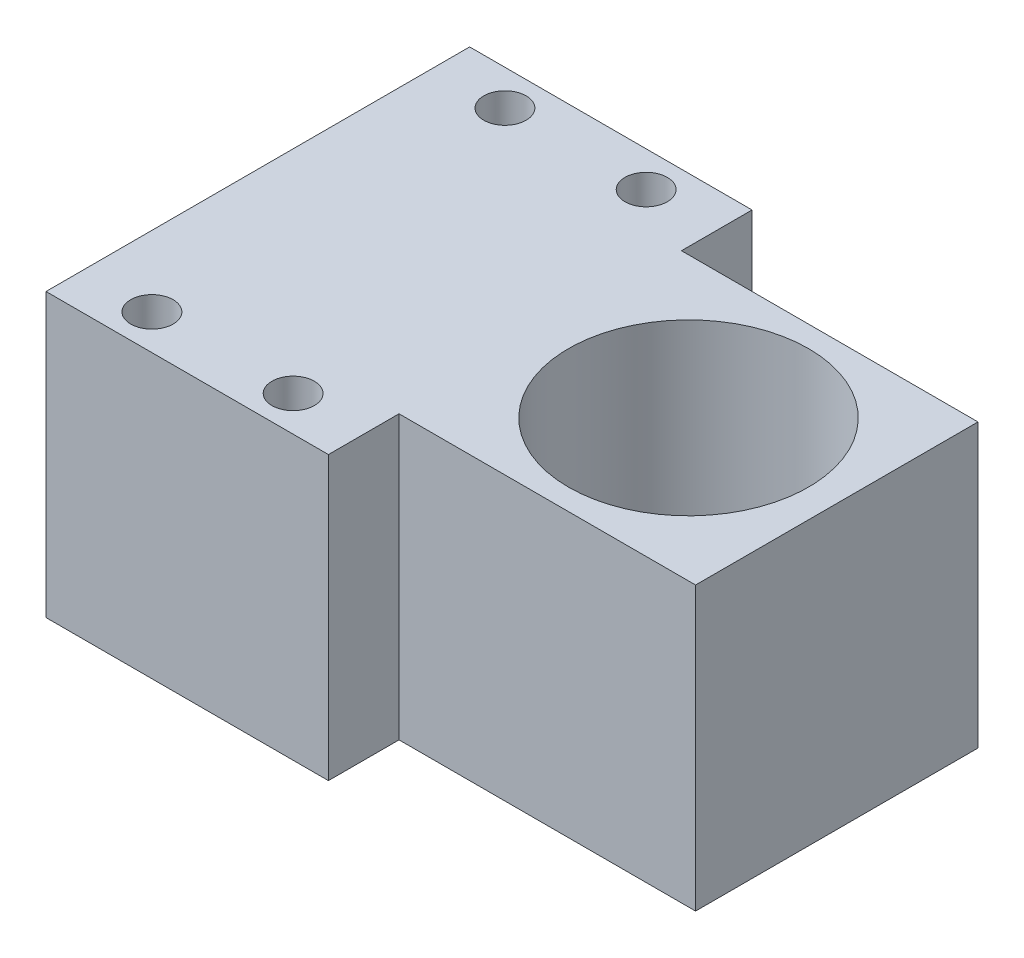
ISO-10303-21;
HEADER;
FILE_DESCRIPTION(('STEP AP214'),'2;1');
FILE_NAME('part.step','',(''),(''),'','','');
FILE_SCHEMA(('AUTOMOTIVE_DESIGN { 1 0 10303 214 1 1 1 1 }'));
ENDSEC;
DATA;
#1=APPLICATION_CONTEXT('core data for automotive mechanical design processes');
#2=APPLICATION_PROTOCOL_DEFINITION('international standard','automotive_design',2000,#1);
#3=PRODUCT_CONTEXT('',#1,'mechanical');
#4=PRODUCT('Part','Part','',(#3));
#5=PRODUCT_RELATED_PRODUCT_CATEGORY('part','',(#4));
#6=PRODUCT_DEFINITION_FORMATION('','',#4);
#7=PRODUCT_DEFINITION_CONTEXT('part definition',#1,'design');
#8=PRODUCT_DEFINITION('design','',#6,#7);
#9=PRODUCT_DEFINITION_SHAPE('','',#8);
#10=(LENGTH_UNIT() NAMED_UNIT(*) SI_UNIT(.MILLI.,.METRE.));
#11=(NAMED_UNIT(*) PLANE_ANGLE_UNIT() SI_UNIT($,.RADIAN.));
#12=(NAMED_UNIT(*) SI_UNIT($,.STERADIAN.) SOLID_ANGLE_UNIT());
#13=UNCERTAINTY_MEASURE_WITH_UNIT(LENGTH_MEASURE(1.E-05),#10,'distance_accuracy_value','');
#14=(GEOMETRIC_REPRESENTATION_CONTEXT(3) GLOBAL_UNCERTAINTY_ASSIGNED_CONTEXT((#13)) GLOBAL_UNIT_ASSIGNED_CONTEXT((#10,
#11,#12)) REPRESENTATION_CONTEXT('',''));
#15=CARTESIAN_POINT('',(0.,0.,0.));
#16=DIRECTION('',(0.,0.,1.));
#17=DIRECTION('',(1.,0.,0.));
#18=AXIS2_PLACEMENT_3D('',#15,#16,#17);
#19=CARTESIAN_POINT('',(10.,-10.,10.));
#20=DIRECTION('',(0.,0.,-1.));
#21=DIRECTION('',(-1.,0.,0.));
#22=AXIS2_PLACEMENT_3D('',#19,#20,#21);
#23=PLANE('',#22);
#24=DIRECTION('',(0.,1.,0.));
#25=VECTOR('',#24,1.);
#26=CARTESIAN_POINT('',(10.0001,10.,10.));
#27=LINE('',#26,#25);
#28=CARTESIAN_POINT('',(10.0001,-10.0000000000001,10.));
#29=VERTEX_POINT('',#28);
#30=CARTESIAN_POINT('',(10.0001,10.,10.));
#31=VERTEX_POINT('',#30);
#32=EDGE_CURVE('E186',#29,#31,#27,.T.);
#33=ORIENTED_EDGE('',*,*,#32,.F.);
#34=DIRECTION('',(-1.,0.,0.));
#35=VECTOR('',#34,1.);
#36=CARTESIAN_POINT('',(31.,-10.0000000000001,10.));
#37=LINE('',#36,#35);
#38=CARTESIAN_POINT('',(31.,-10.0000000000001,10.));
#39=VERTEX_POINT('',#38);
#40=EDGE_CURVE('E158',#39,#29,#37,.T.);
#41=ORIENTED_EDGE('',*,*,#40,.F.);
#42=DIRECTION('',(0.,-1.,0.));
#43=VECTOR('',#42,1.);
#44=CARTESIAN_POINT('',(31.,10.,10.));
#45=LINE('',#44,#43);
#46=CARTESIAN_POINT('',(31.,10.,10.));
#47=VERTEX_POINT('',#46);
#48=EDGE_CURVE('E139',#47,#39,#45,.T.);
#49=ORIENTED_EDGE('',*,*,#48,.F.);
#50=DIRECTION('',(-1.,0.,0.));
#51=VECTOR('',#50,1.);
#52=CARTESIAN_POINT('',(31.,10.,10.));
#53=LINE('',#52,#51);
#54=EDGE_CURVE('E150',#47,#31,#53,.T.);
#55=ORIENTED_EDGE('',*,*,#54,.T.);
#56=EDGE_LOOP('',(#33,#41,#49,#55));
#57=FACE_BOUND('',#56,.T.);
#58=ADVANCED_FACE('F37',(#57),#23,.F.);
#59=CARTESIAN_POINT('',(10.,-10.,-9.99999999999999));
#60=DIRECTION('',(0.,0.,1.));
#61=DIRECTION('',(1.,0.,0.));
#62=AXIS2_PLACEMENT_3D('',#59,#60,#61);
#63=PLANE('',#62);
#64=DIRECTION('',(-1.,0.,0.));
#65=VECTOR('',#64,1.);
#66=CARTESIAN_POINT('',(31.,-10.0000000000001,-9.99999999999994));
#67=LINE('',#66,#65);
#68=CARTESIAN_POINT('',(31.,-10.0000000000001,-9.99999999999994));
#69=VERTEX_POINT('',#68);
#70=CARTESIAN_POINT('',(10.0001,-10.0000000000001,-9.99999999999994));
#71=VERTEX_POINT('',#70);
#72=EDGE_CURVE('E155',#69,#71,#67,.T.);
#73=ORIENTED_EDGE('',*,*,#72,.T.);
#74=DIRECTION('',(0.,-1.,0.));
#75=VECTOR('',#74,1.);
#76=CARTESIAN_POINT('',(10.0001,10.,-9.99999999999999));
#77=LINE('',#76,#75);
#78=CARTESIAN_POINT('',(10.0001,10.,-9.99999999999994));
#79=VERTEX_POINT('',#78);
#80=EDGE_CURVE('E179',#79,#71,#77,.T.);
#81=ORIENTED_EDGE('',*,*,#80,.F.);
#82=DIRECTION('',(-1.,0.,0.));
#83=VECTOR('',#82,1.);
#84=CARTESIAN_POINT('',(31.,10.,-9.99999999999994));
#85=LINE('',#84,#83);
#86=CARTESIAN_POINT('',(31.,10.,-9.99999999999994));
#87=VERTEX_POINT('',#86);
#88=EDGE_CURVE('E152',#87,#79,#85,.T.);
#89=ORIENTED_EDGE('',*,*,#88,.F.);
#90=DIRECTION('',(0.,1.,0.));
#91=VECTOR('',#90,1.);
#92=CARTESIAN_POINT('',(31.,10.,-9.99999999999994));
#93=LINE('',#92,#91);
#94=EDGE_CURVE('E146',#69,#87,#93,.T.);
#95=ORIENTED_EDGE('',*,*,#94,.F.);
#96=EDGE_LOOP('',(#73,#81,#89,#95));
#97=FACE_BOUND('',#96,.T.);
#98=ADVANCED_FACE('F219',(#97),#63,.F.);
#99=CARTESIAN_POINT('',(10.,-10.,-9.99999999999999));
#100=DIRECTION('',(0.,1.,0.));
#101=DIRECTION('',(0.,0.,1.));
#102=AXIS2_PLACEMENT_3D('',#99,#100,#101);
#103=PLANE('',#102);
#104=CARTESIAN_POINT('',(-4.99995,-10.,12.5));
#105=DIRECTION('',(0.,-1.,0.));
#106=DIRECTION('',(0.,0.,-1.));
#107=AXIS2_PLACEMENT_3D('',#104,#105,#106);
#108=CIRCLE('',#107,1.5);
#109=CARTESIAN_POINT('',(-4.99995,-10.,11.));
#110=VERTEX_POINT('',#109);
#111=EDGE_CURVE('E459',#110,#110,#108,.T.);
#112=ORIENTED_EDGE('',*,*,#111,.F.);
#113=EDGE_LOOP('',(#112));
#114=FACE_BOUND('',#113,.T.);
#115=CARTESIAN_POINT('',(-4.99995,-9.99999999999999,-12.4999999999999));
#116=DIRECTION('',(0.,-1.,0.));
#117=DIRECTION('',(0.,0.,-1.));
#118=AXIS2_PLACEMENT_3D('',#115,#116,#117);
#119=CIRCLE('',#118,1.5);
#120=CARTESIAN_POINT('',(-4.99995,-9.99999999999999,-13.9999999999999));
#121=VERTEX_POINT('',#120);
#122=EDGE_CURVE('E461',#121,#121,#119,.T.);
#123=ORIENTED_EDGE('',*,*,#122,.F.);
#124=EDGE_LOOP('',(#123));
#125=FACE_BOUND('',#124,.T.);
#126=CARTESIAN_POINT('',(20.50005,-10.0000000000001,0.));
#127=DIRECTION('',(0.,1.,0.));
#128=DIRECTION('',(0.,0.,1.));
#129=AXIS2_PLACEMENT_3D('',#126,#127,#128);
#130=CIRCLE('',#129,8.5);
#131=CARTESIAN_POINT('',(20.50005,-10.0000000000001,8.50000000000003));
#132=VERTEX_POINT('',#131);
#133=EDGE_CURVE('E136',#132,#132,#130,.T.);
#134=ORIENTED_EDGE('',*,*,#133,.T.);
#135=EDGE_LOOP('',(#134));
#136=FACE_BOUND('',#135,.T.);
#137=ORIENTED_EDGE('',*,*,#40,.T.);
#138=DIRECTION('',(0.,0.,-1.));
#139=VECTOR('',#138,1.);
#140=CARTESIAN_POINT('',(10.0001,-10.,10.));
#141=LINE('',#140,#139);
#142=CARTESIAN_POINT('',(10.0001,-10.,15.));
#143=VERTEX_POINT('',#142);
#144=EDGE_CURVE('E107',#143,#29,#141,.T.);
#145=ORIENTED_EDGE('',*,*,#144,.F.);
#146=DIRECTION('',(1.,0.,0.));
#147=VECTOR('',#146,1.);
#148=CARTESIAN_POINT('',(0.,-10.,15.));
#149=LINE('',#148,#147);
#150=CARTESIAN_POINT('',(-10.,-10.0000000000001,15.));
#151=VERTEX_POINT('',#150);
#152=EDGE_CURVE('E117',#151,#143,#149,.T.);
#153=ORIENTED_EDGE('',*,*,#152,.F.);
#154=DIRECTION('',(0.,0.,1.));
#155=VECTOR('',#154,1.);
#156=CARTESIAN_POINT('',(-10.,-10.0000000000001,-14.9999999999999));
#157=LINE('',#156,#155);
#158=CARTESIAN_POINT('',(-10.,-10.0000000000001,-14.9999999999999));
#159=VERTEX_POINT('',#158);
#160=EDGE_CURVE('E111',#159,#151,#157,.T.);
#161=ORIENTED_EDGE('',*,*,#160,.F.);
#162=DIRECTION('',(1.,0.,0.));
#163=VECTOR('',#162,1.);
#164=CARTESIAN_POINT('',(0.,-10.0000000000001,-14.9999999999999));
#165=LINE('',#164,#163);
#166=CARTESIAN_POINT('',(10.0001,-10.0000000000001,-14.9999999999999));
#167=VERTEX_POINT('',#166);
#168=EDGE_CURVE('E98',#159,#167,#165,.T.);
#169=ORIENTED_EDGE('',*,*,#168,.T.);
#170=DIRECTION('',(0.,0.,-1.));
#171=VECTOR('',#170,1.);
#172=CARTESIAN_POINT('',(10.0001,-10.0000000000001,-9.99999999999994));
#173=LINE('',#172,#171);
#174=EDGE_CURVE('E108',#71,#167,#173,.T.);
#175=ORIENTED_EDGE('',*,*,#174,.F.);
#176=ORIENTED_EDGE('',*,*,#72,.F.);
#177=DIRECTION('',(0.,0.,-1.));
#178=VECTOR('',#177,1.);
#179=CARTESIAN_POINT('',(31.,-10.0000000000001,10.));
#180=LINE('',#179,#178);
#181=EDGE_CURVE('E144',#39,#69,#180,.T.);
#182=ORIENTED_EDGE('',*,*,#181,.F.);
#183=EDGE_LOOP('',(#137,#145,#153,#161,#169,#175,#176,#182));
#184=FACE_BOUND('',#183,.T.);
#185=CARTESIAN_POINT('',(5.00005,-10.,12.5));
#186=DIRECTION('',(0.,-1.,0.));
#187=DIRECTION('',(0.,0.,-1.));
#188=AXIS2_PLACEMENT_3D('',#185,#186,#187);
#189=CIRCLE('',#188,1.5);
#190=CARTESIAN_POINT('',(5.00005,-10.,11.));
#191=VERTEX_POINT('',#190);
#192=EDGE_CURVE('E163',#191,#191,#189,.T.);
#193=ORIENTED_EDGE('',*,*,#192,.F.);
#194=EDGE_LOOP('',(#193));
#195=FACE_BOUND('',#194,.T.);
#196=CARTESIAN_POINT('',(5.00005,-9.99999999999999,-12.4999999999999));
#197=DIRECTION('',(0.,-1.,0.));
#198=DIRECTION('',(0.,0.,-1.));
#199=AXIS2_PLACEMENT_3D('',#196,#197,#198);
#200=CIRCLE('',#199,1.50000000000006);
#201=CARTESIAN_POINT('',(5.00005,-9.99999999999999,-14.));
#202=VERTEX_POINT('',#201);
#203=EDGE_CURVE('E167',#202,#202,#200,.T.);
#204=ORIENTED_EDGE('',*,*,#203,.F.);
#205=EDGE_LOOP('',(#204));
#206=FACE_BOUND('',#205,.T.);
#207=ADVANCED_FACE('F113',(#114,#125,#136,#184,#195,#206),#103,.F.);
#208=CARTESIAN_POINT('',(10.,10.,-9.99999999999999));
#209=DIRECTION('',(0.,-1.,0.));
#210=DIRECTION('',(0.,0.,-1.));
#211=AXIS2_PLACEMENT_3D('',#208,#209,#210);
#212=PLANE('',#211);
#213=CARTESIAN_POINT('',(-4.99995,10.,12.5));
#214=DIRECTION('',(0.,-1.,0.));
#215=DIRECTION('',(0.,0.,-1.));
#216=AXIS2_PLACEMENT_3D('',#213,#214,#215);
#217=CIRCLE('',#216,1.5);
#218=CARTESIAN_POINT('',(-4.99995,10.,11.));
#219=VERTEX_POINT('',#218);
#220=EDGE_CURVE('E457',#219,#219,#217,.T.);
#221=ORIENTED_EDGE('',*,*,#220,.T.);
#222=EDGE_LOOP('',(#221));
#223=FACE_BOUND('',#222,.T.);
#224=CARTESIAN_POINT('',(-4.99995,10.,-12.4999999999999));
#225=DIRECTION('',(0.,-1.,0.));
#226=DIRECTION('',(0.,0.,-1.));
#227=AXIS2_PLACEMENT_3D('',#224,#225,#226);
#228=CIRCLE('',#227,1.5);
#229=CARTESIAN_POINT('',(-4.99995,10.,-13.9999999999999));
#230=VERTEX_POINT('',#229);
#231=EDGE_CURVE('E129',#230,#230,#228,.T.);
#232=ORIENTED_EDGE('',*,*,#231,.T.);
#233=EDGE_LOOP('',(#232));
#234=FACE_BOUND('',#233,.T.);
#235=CARTESIAN_POINT('',(20.50005,10.,0.));
#236=DIRECTION('',(0.,1.,0.));
#237=DIRECTION('',(0.,0.,1.));
#238=AXIS2_PLACEMENT_3D('',#235,#236,#237);
#239=CIRCLE('',#238,8.5);
#240=CARTESIAN_POINT('',(20.50005,10.,8.50000000000004));
#241=VERTEX_POINT('',#240);
#242=EDGE_CURVE('E135',#241,#241,#239,.T.);
#243=ORIENTED_EDGE('',*,*,#242,.F.);
#244=EDGE_LOOP('',(#243));
#245=FACE_BOUND('',#244,.T.);
#246=DIRECTION('',(0.,0.,1.));
#247=VECTOR('',#246,1.);
#248=CARTESIAN_POINT('',(10.0001,10.,10.));
#249=LINE('',#248,#247);
#250=CARTESIAN_POINT('',(10.0001,10.,15.));
#251=VERTEX_POINT('',#250);
#252=EDGE_CURVE('E189',#31,#251,#249,.T.);
#253=ORIENTED_EDGE('',*,*,#252,.F.);
#254=ORIENTED_EDGE('',*,*,#54,.F.);
#255=DIRECTION('',(0.,0.,1.));
#256=VECTOR('',#255,1.);
#257=CARTESIAN_POINT('',(31.,10.,10.));
#258=LINE('',#257,#256);
#259=EDGE_CURVE('E148',#87,#47,#258,.T.);
#260=ORIENTED_EDGE('',*,*,#259,.F.);
#261=ORIENTED_EDGE('',*,*,#88,.T.);
#262=DIRECTION('',(0.,0.,1.));
#263=VECTOR('',#262,1.);
#264=CARTESIAN_POINT('',(10.0001,10.,-9.99999999999999));
#265=LINE('',#264,#263);
#266=CARTESIAN_POINT('',(10.0001,10.,-15.));
#267=VERTEX_POINT('',#266);
#268=EDGE_CURVE('E182',#267,#79,#265,.T.);
#269=ORIENTED_EDGE('',*,*,#268,.F.);
#270=DIRECTION('',(1.,0.,0.));
#271=VECTOR('',#270,1.);
#272=CARTESIAN_POINT('',(0.,10.,-15.));
#273=LINE('',#272,#271);
#274=CARTESIAN_POINT('',(-10.,10.,-14.9999999999999));
#275=VERTEX_POINT('',#274);
#276=EDGE_CURVE('E57',#275,#267,#273,.T.);
#277=ORIENTED_EDGE('',*,*,#276,.F.);
#278=DIRECTION('',(0.,0.,-1.));
#279=VECTOR('',#278,1.);
#280=CARTESIAN_POINT('',(-10.,10.,-14.9999999999999));
#281=LINE('',#280,#279);
#282=CARTESIAN_POINT('',(-10.,10.,15.));
#283=VERTEX_POINT('',#282);
#284=EDGE_CURVE('E125',#283,#275,#281,.T.);
#285=ORIENTED_EDGE('',*,*,#284,.F.);
#286=DIRECTION('',(1.,0.,0.));
#287=VECTOR('',#286,1.);
#288=CARTESIAN_POINT('',(0.,10.,15.));
#289=LINE('',#288,#287);
#290=EDGE_CURVE('E11',#283,#251,#289,.T.);
#291=ORIENTED_EDGE('',*,*,#290,.T.);
#292=EDGE_LOOP('',(#253,#254,#260,#261,#269,#277,#285,#291));
#293=FACE_BOUND('',#292,.T.);
#294=CARTESIAN_POINT('',(5.00005,10.,12.5));
#295=DIRECTION('',(0.,-1.,0.));
#296=DIRECTION('',(0.,0.,-1.));
#297=AXIS2_PLACEMENT_3D('',#294,#295,#296);
#298=CIRCLE('',#297,1.5);
#299=CARTESIAN_POINT('',(5.00005,10.,11.));
#300=VERTEX_POINT('',#299);
#301=EDGE_CURVE('E164',#300,#300,#298,.T.);
#302=ORIENTED_EDGE('',*,*,#301,.T.);
#303=EDGE_LOOP('',(#302));
#304=FACE_BOUND('',#303,.T.);
#305=CARTESIAN_POINT('',(5.00005,10.,-12.4999999999999));
#306=DIRECTION('',(0.,-1.,0.));
#307=DIRECTION('',(0.,0.,-1.));
#308=AXIS2_PLACEMENT_3D('',#305,#306,#307);
#309=CIRCLE('',#308,1.50000000000006);
#310=CARTESIAN_POINT('',(5.00005,10.,-14.));
#311=VERTEX_POINT('',#310);
#312=EDGE_CURVE('E170',#311,#311,#309,.T.);
#313=ORIENTED_EDGE('',*,*,#312,.T.);
#314=EDGE_LOOP('',(#313));
#315=FACE_BOUND('',#314,.T.);
#316=ADVANCED_FACE('F201',(#223,#234,#245,#293,#304,#315),#212,.F.);
#317=CARTESIAN_POINT('',(0.,10.,15.));
#318=DIRECTION('',(0.,0.,1.));
#319=DIRECTION('',(1.,0.,0.));
#320=AXIS2_PLACEMENT_3D('',#317,#318,#319);
#321=PLANE('',#320);
#322=ORIENTED_EDGE('',*,*,#290,.F.);
#323=DIRECTION('',(0.,1.,0.));
#324=VECTOR('',#323,1.);
#325=CARTESIAN_POINT('',(-10.,-10.0000000000001,15.));
#326=LINE('',#325,#324);
#327=EDGE_CURVE('E121',#151,#283,#326,.T.);
#328=ORIENTED_EDGE('',*,*,#327,.F.);
#329=ORIENTED_EDGE('',*,*,#152,.T.);
#330=DIRECTION('',(0.,-1.,0.));
#331=VECTOR('',#330,1.);
#332=CARTESIAN_POINT('',(10.0001,10.,15.));
#333=LINE('',#332,#331);
#334=EDGE_CURVE('E44',#251,#143,#333,.T.);
#335=ORIENTED_EDGE('',*,*,#334,.F.);
#336=EDGE_LOOP('',(#322,#328,#329,#335));
#337=FACE_BOUND('',#336,.T.);
#338=ADVANCED_FACE('F194',(#337),#321,.T.);
#339=CARTESIAN_POINT('',(10.0001,0.,0.));
#340=DIRECTION('',(-1.,0.,0.));
#341=DIRECTION('',(0.,0.,1.));
#342=AXIS2_PLACEMENT_3D('',#339,#340,#341);
#343=PLANE('',#342);
#344=ORIENTED_EDGE('',*,*,#32,.T.);
#345=ORIENTED_EDGE('',*,*,#252,.T.);
#346=ORIENTED_EDGE('',*,*,#334,.T.);
#347=ORIENTED_EDGE('',*,*,#144,.T.);
#348=EDGE_LOOP('',(#344,#345,#346,#347));
#349=FACE_BOUND('',#348,.T.);
#350=ADVANCED_FACE('F192',(#349),#343,.F.);
#351=CARTESIAN_POINT('',(0.,10.,-15.));
#352=DIRECTION('',(0.,0.,-1.));
#353=DIRECTION('',(-1.,0.,0.));
#354=AXIS2_PLACEMENT_3D('',#351,#352,#353);
#355=PLANE('',#354);
#356=ORIENTED_EDGE('',*,*,#276,.T.);
#357=DIRECTION('',(0.,1.,0.));
#358=VECTOR('',#357,1.);
#359=CARTESIAN_POINT('',(10.0001,10.,-15.));
#360=LINE('',#359,#358);
#361=EDGE_CURVE('E103',#167,#267,#360,.T.);
#362=ORIENTED_EDGE('',*,*,#361,.F.);
#363=ORIENTED_EDGE('',*,*,#168,.F.);
#364=DIRECTION('',(0.,-1.,0.));
#365=VECTOR('',#364,1.);
#366=CARTESIAN_POINT('',(-10.,-10.0000000000001,-14.9999999999999));
#367=LINE('',#366,#365);
#368=EDGE_CURVE('E102',#275,#159,#367,.T.);
#369=ORIENTED_EDGE('',*,*,#368,.F.);
#370=EDGE_LOOP('',(#356,#362,#363,#369));
#371=FACE_BOUND('',#370,.T.);
#372=ADVANCED_FACE('F100',(#371),#355,.T.);
#373=CARTESIAN_POINT('',(10.0001,0.,0.));
#374=DIRECTION('',(1.,0.,0.));
#375=DIRECTION('',(0.,0.,-1.));
#376=AXIS2_PLACEMENT_3D('',#373,#374,#375);
#377=PLANE('',#376);
#378=ORIENTED_EDGE('',*,*,#80,.T.);
#379=ORIENTED_EDGE('',*,*,#174,.T.);
#380=ORIENTED_EDGE('',*,*,#361,.T.);
#381=ORIENTED_EDGE('',*,*,#268,.T.);
#382=EDGE_LOOP('',(#378,#379,#380,#381));
#383=FACE_BOUND('',#382,.T.);
#384=ADVANCED_FACE('F214',(#383),#377,.T.);
#385=CARTESIAN_POINT('',(5.00005,10.,-12.4999999999999));
#386=DIRECTION('',(0.,-1.,0.));
#387=DIRECTION('',(0.,0.,-1.));
#388=AXIS2_PLACEMENT_3D('',#385,#386,#387);
#389=CYLINDRICAL_SURFACE('',#388,1.50000000000006);
#390=ORIENTED_EDGE('',*,*,#312,.F.);
#391=EDGE_LOOP('',(#390));
#392=FACE_BOUND('',#391,.T.);
#393=ORIENTED_EDGE('',*,*,#203,.T.);
#394=EDGE_LOOP('',(#393));
#395=FACE_BOUND('',#394,.T.);
#396=ADVANCED_FACE('F210',(#392,#395),#389,.F.);
#397=CARTESIAN_POINT('',(5.00005,10.,12.5));
#398=DIRECTION('',(0.,-1.,0.));
#399=DIRECTION('',(0.,0.,-1.));
#400=AXIS2_PLACEMENT_3D('',#397,#398,#399);
#401=CYLINDRICAL_SURFACE('',#400,1.5);
#402=ORIENTED_EDGE('',*,*,#301,.F.);
#403=EDGE_LOOP('',(#402));
#404=FACE_BOUND('',#403,.T.);
#405=ORIENTED_EDGE('',*,*,#192,.T.);
#406=EDGE_LOOP('',(#405));
#407=FACE_BOUND('',#406,.T.);
#408=ADVANCED_FACE('F213',(#404,#407),#401,.F.);
#409=CARTESIAN_POINT('',(31.,0.,0.));
#410=DIRECTION('',(1.,0.,0.));
#411=DIRECTION('',(0.,0.,-1.));
#412=AXIS2_PLACEMENT_3D('',#409,#410,#411);
#413=PLANE('',#412);
#414=ORIENTED_EDGE('',*,*,#48,.T.);
#415=ORIENTED_EDGE('',*,*,#181,.T.);
#416=ORIENTED_EDGE('',*,*,#94,.T.);
#417=ORIENTED_EDGE('',*,*,#259,.T.);
#418=EDGE_LOOP('',(#414,#415,#416,#417));
#419=FACE_BOUND('',#418,.T.);
#420=ADVANCED_FACE('F264',(#419),#413,.T.);
#421=CARTESIAN_POINT('',(20.50005,-10.0000000000001,0.));
#422=DIRECTION('',(0.,1.,0.));
#423=DIRECTION('',(0.,0.,1.));
#424=AXIS2_PLACEMENT_3D('',#421,#422,#423);
#425=CYLINDRICAL_SURFACE('',#424,8.5);
#426=ORIENTED_EDGE('',*,*,#133,.F.);
#427=EDGE_LOOP('',(#426));
#428=FACE_BOUND('',#427,.T.);
#429=ORIENTED_EDGE('',*,*,#242,.T.);
#430=EDGE_LOOP('',(#429));
#431=FACE_BOUND('',#430,.T.);
#432=ADVANCED_FACE('F292',(#428,#431),#425,.F.);
#433=CARTESIAN_POINT('',(-10.,0.,0.));
#434=DIRECTION('',(1.,0.,0.));
#435=DIRECTION('',(0.,0.,-1.));
#436=AXIS2_PLACEMENT_3D('',#433,#434,#435);
#437=PLANE('',#436);
#438=CARTESIAN_POINT('',(-10.,0.,0.));
#439=DIRECTION('',(-1.,0.,0.));
#440=DIRECTION('',(0.,0.,1.));
#441=AXIS2_PLACEMENT_3D('',#438,#439,#440);
#442=CIRCLE('',#441,7.5);
#443=CARTESIAN_POINT('',(-10.,0.,7.5));
#444=VERTEX_POINT('',#443);
#445=EDGE_CURVE('E126',#444,#444,#442,.T.);
#446=ORIENTED_EDGE('',*,*,#445,.F.);
#447=EDGE_LOOP('',(#446));
#448=FACE_BOUND('',#447,.T.);
#449=ORIENTED_EDGE('',*,*,#368,.T.);
#450=ORIENTED_EDGE('',*,*,#160,.T.);
#451=ORIENTED_EDGE('',*,*,#327,.T.);
#452=ORIENTED_EDGE('',*,*,#284,.T.);
#453=EDGE_LOOP('',(#449,#450,#451,#452));
#454=FACE_BOUND('',#453,.T.);
#455=ADVANCED_FACE('F124',(#448,#454),#437,.F.);
#456=CARTESIAN_POINT('',(10.,0.,0.));
#457=DIRECTION('',(1.,0.,0.));
#458=DIRECTION('',(0.,0.,-1.));
#459=AXIS2_PLACEMENT_3D('',#456,#457,#458);
#460=PLANE('',#459);
#461=CARTESIAN_POINT('',(10.,0.,0.));
#462=DIRECTION('',(1.,0.,0.));
#463=DIRECTION('',(0.,0.,-1.));
#464=AXIS2_PLACEMENT_3D('',#461,#462,#463);
#465=CIRCLE('',#464,7.5);
#466=CARTESIAN_POINT('',(10.,0.,-7.49999999999999));
#467=VERTEX_POINT('',#466);
#468=EDGE_CURVE('E160',#467,#467,#465,.T.);
#469=ORIENTED_EDGE('',*,*,#468,.F.);
#470=EDGE_LOOP('',(#469));
#471=FACE_BOUND('',#470,.T.);
#472=ADVANCED_FACE('F291',(#471),#460,.F.);
#473=CARTESIAN_POINT('',(10.,0.,0.));
#474=DIRECTION('',(-1.,0.,0.));
#475=DIRECTION('',(0.,0.,1.));
#476=AXIS2_PLACEMENT_3D('',#473,#474,#475);
#477=CYLINDRICAL_SURFACE('',#476,7.5);
#478=ORIENTED_EDGE('',*,*,#468,.T.);
#479=EDGE_LOOP('',(#478));
#480=FACE_BOUND('',#479,.T.);
#481=ORIENTED_EDGE('',*,*,#445,.T.);
#482=EDGE_LOOP('',(#481));
#483=FACE_BOUND('',#482,.T.);
#484=ADVANCED_FACE('F300',(#480,#483),#477,.F.);
#485=CARTESIAN_POINT('',(-4.99995,10.,-12.4999999999999));
#486=DIRECTION('',(0.,-1.,0.));
#487=DIRECTION('',(0.,0.,-1.));
#488=AXIS2_PLACEMENT_3D('',#485,#486,#487);
#489=CYLINDRICAL_SURFACE('',#488,1.5);
#490=ORIENTED_EDGE('',*,*,#231,.F.);
#491=EDGE_LOOP('',(#490));
#492=FACE_BOUND('',#491,.T.);
#493=ORIENTED_EDGE('',*,*,#122,.T.);
#494=EDGE_LOOP('',(#493));
#495=FACE_BOUND('',#494,.T.);
#496=ADVANCED_FACE('F302',(#492,#495),#489,.F.);
#497=CARTESIAN_POINT('',(-4.99995,10.,12.5));
#498=DIRECTION('',(0.,-1.,0.));
#499=DIRECTION('',(0.,0.,-1.));
#500=AXIS2_PLACEMENT_3D('',#497,#498,#499);
#501=CYLINDRICAL_SURFACE('',#500,1.5);
#502=ORIENTED_EDGE('',*,*,#220,.F.);
#503=EDGE_LOOP('',(#502));
#504=FACE_BOUND('',#503,.T.);
#505=ORIENTED_EDGE('',*,*,#111,.T.);
#506=EDGE_LOOP('',(#505));
#507=FACE_BOUND('',#506,.T.);
#508=ADVANCED_FACE('F324',(#504,#507),#501,.F.);
#509=CLOSED_SHELL('',(#58,#98,#207,#316,#338,#350,#372,#384,#396,#408,#420,#432,#455,#472,#484,
#496,#508));
#510=MANIFOLD_SOLID_BREP('B2',#509);
#511=ADVANCED_BREP_SHAPE_REPRESENTATION('',(#18,#510),#14);
#512=SHAPE_DEFINITION_REPRESENTATION(#9,#511);
ENDSEC;
END-ISO-10303-21;
